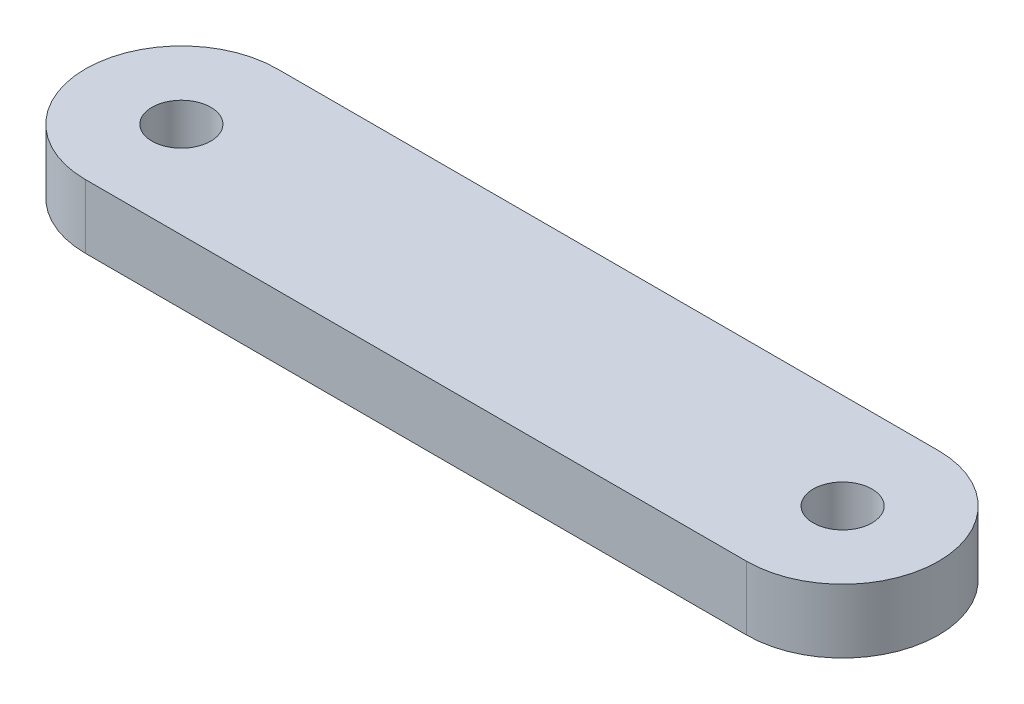
ISO-10303-21;
HEADER;
FILE_DESCRIPTION(('STEP AP214'),'2;1');
FILE_NAME('part.step','',(''),(''),'','','');
FILE_SCHEMA(('AUTOMOTIVE_DESIGN { 1 0 10303 214 1 1 1 1 }'));
ENDSEC;
DATA;
#1=APPLICATION_CONTEXT('core data for automotive mechanical design processes');
#2=APPLICATION_PROTOCOL_DEFINITION('international standard','automotive_design',2000,#1);
#3=PRODUCT_CONTEXT('',#1,'mechanical');
#4=PRODUCT('Part','Part','',(#3));
#5=PRODUCT_RELATED_PRODUCT_CATEGORY('part','',(#4));
#6=PRODUCT_DEFINITION_FORMATION('','',#4);
#7=PRODUCT_DEFINITION_CONTEXT('part definition',#1,'design');
#8=PRODUCT_DEFINITION('design','',#6,#7);
#9=PRODUCT_DEFINITION_SHAPE('','',#8);
#10=(LENGTH_UNIT() NAMED_UNIT(*) SI_UNIT(.MILLI.,.METRE.));
#11=(NAMED_UNIT(*) PLANE_ANGLE_UNIT() SI_UNIT($,.RADIAN.));
#12=(NAMED_UNIT(*) SI_UNIT($,.STERADIAN.) SOLID_ANGLE_UNIT());
#13=UNCERTAINTY_MEASURE_WITH_UNIT(LENGTH_MEASURE(1.E-05),#10,'distance_accuracy_value','');
#14=(GEOMETRIC_REPRESENTATION_CONTEXT(3) GLOBAL_UNCERTAINTY_ASSIGNED_CONTEXT((#13)) GLOBAL_UNIT_ASSIGNED_CONTEXT((#10,
#11,#12)) REPRESENTATION_CONTEXT('',''));
#15=CARTESIAN_POINT('',(0.,0.,0.));
#16=DIRECTION('',(0.,0.,1.));
#17=DIRECTION('',(1.,0.,0.));
#18=AXIS2_PLACEMENT_3D('',#15,#16,#17);
#19=CARTESIAN_POINT('',(25.8567228354206,5.,0.));
#20=DIRECTION('',(0.,-1.,0.));
#21=DIRECTION('',(0.,0.,-1.));
#22=AXIS2_PLACEMENT_3D('',#19,#20,#21);
#23=PLANE('',#22);
#24=CARTESIAN_POINT('',(25.8567228354206,5.,0.));
#25=DIRECTION('',(0.,1.,0.));
#26=DIRECTION('',(0.,0.,-1.));
#27=AXIS2_PLACEMENT_3D('',#24,#25,#26);
#28=CIRCLE('',#27,7.5);
#29=CARTESIAN_POINT('',(25.8567228354206,5.,7.5));
#30=VERTEX_POINT('',#29);
#31=CARTESIAN_POINT('',(25.8567228354206,5.,-7.5));
#32=VERTEX_POINT('',#31);
#33=EDGE_CURVE('E87',#30,#32,#28,.T.);
#34=ORIENTED_EDGE('',*,*,#33,.T.);
#35=DIRECTION('',(-1.,0.,0.));
#36=VECTOR('',#35,1.);
#37=CARTESIAN_POINT('',(-25.8567228354206,5.,-7.5));
#38=LINE('',#37,#36);
#39=CARTESIAN_POINT('',(-25.8567228354206,5.,-7.5));
#40=VERTEX_POINT('',#39);
#41=EDGE_CURVE('E82',#32,#40,#38,.T.);
#42=ORIENTED_EDGE('',*,*,#41,.T.);
#43=CARTESIAN_POINT('',(-25.8567228354206,5.,0.));
#44=DIRECTION('',(0.,1.,0.));
#45=DIRECTION('',(0.,0.,1.));
#46=AXIS2_PLACEMENT_3D('',#43,#44,#45);
#47=CIRCLE('',#46,7.5);
#48=CARTESIAN_POINT('',(-25.8567228354206,5.,7.5));
#49=VERTEX_POINT('',#48);
#50=EDGE_CURVE('E85',#40,#49,#47,.T.);
#51=ORIENTED_EDGE('',*,*,#50,.T.);
#52=DIRECTION('',(1.,0.,0.));
#53=VECTOR('',#52,1.);
#54=CARTESIAN_POINT('',(-25.8567228354206,5.,7.5));
#55=LINE('',#54,#53);
#56=EDGE_CURVE('E52',#49,#30,#55,.T.);
#57=ORIENTED_EDGE('',*,*,#56,.T.);
#58=EDGE_LOOP('',(#34,#42,#51,#57));
#59=FACE_BOUND('',#58,.T.);
#60=CARTESIAN_POINT('',(-25.8567228354206,5.,0.));
#61=DIRECTION('',(0.,1.,0.));
#62=DIRECTION('',(0.,0.,1.));
#63=AXIS2_PLACEMENT_3D('',#60,#61,#62);
#64=CIRCLE('',#63,2.30000000000001);
#65=CARTESIAN_POINT('',(-25.8567228354206,5.,2.3));
#66=VERTEX_POINT('',#65);
#67=EDGE_CURVE('E102',#66,#66,#64,.T.);
#68=ORIENTED_EDGE('',*,*,#67,.F.);
#69=EDGE_LOOP('',(#68));
#70=FACE_BOUND('',#69,.T.);
#71=CARTESIAN_POINT('',(25.8567228354206,5.,0.));
#72=DIRECTION('',(0.,1.,0.));
#73=DIRECTION('',(0.,0.,1.));
#74=AXIS2_PLACEMENT_3D('',#71,#72,#73);
#75=CIRCLE('',#74,2.3);
#76=CARTESIAN_POINT('',(25.8567228354206,5.,2.3));
#77=VERTEX_POINT('',#76);
#78=EDGE_CURVE('E117',#77,#77,#75,.T.);
#79=ORIENTED_EDGE('',*,*,#78,.F.);
#80=EDGE_LOOP('',(#79));
#81=FACE_BOUND('',#80,.T.);
#82=ADVANCED_FACE('F35',(#59,#70,#81),#23,.F.);
#83=CARTESIAN_POINT('',(25.8567228354206,0.,0.));
#84=DIRECTION('',(0.,-1.,0.));
#85=DIRECTION('',(0.,0.,-1.));
#86=AXIS2_PLACEMENT_3D('',#83,#84,#85);
#87=PLANE('',#86);
#88=CARTESIAN_POINT('',(-25.8567228354206,0.,0.));
#89=DIRECTION('',(0.,1.,0.));
#90=DIRECTION('',(0.,0.,1.));
#91=AXIS2_PLACEMENT_3D('',#88,#89,#90);
#92=CIRCLE('',#91,2.30000000000001);
#93=CARTESIAN_POINT('',(-25.8567228354206,0.,2.3));
#94=VERTEX_POINT('',#93);
#95=EDGE_CURVE('E114',#94,#94,#92,.T.);
#96=ORIENTED_EDGE('',*,*,#95,.T.);
#97=EDGE_LOOP('',(#96));
#98=FACE_BOUND('',#97,.T.);
#99=CARTESIAN_POINT('',(25.8567228354206,0.,0.));
#100=DIRECTION('',(0.,1.,0.));
#101=DIRECTION('',(0.,0.,-1.));
#102=AXIS2_PLACEMENT_3D('',#99,#100,#101);
#103=CIRCLE('',#102,7.5);
#104=CARTESIAN_POINT('',(25.8567228354206,0.,7.5));
#105=VERTEX_POINT('',#104);
#106=CARTESIAN_POINT('',(25.8567228354206,0.,-7.5));
#107=VERTEX_POINT('',#106);
#108=EDGE_CURVE('E99',#105,#107,#103,.T.);
#109=ORIENTED_EDGE('',*,*,#108,.F.);
#110=DIRECTION('',(1.,0.,0.));
#111=VECTOR('',#110,1.);
#112=CARTESIAN_POINT('',(-25.8567228354206,0.,7.5));
#113=LINE('',#112,#111);
#114=CARTESIAN_POINT('',(-25.8567228354206,0.,7.5));
#115=VERTEX_POINT('',#114);
#116=EDGE_CURVE('E75',#115,#105,#113,.T.);
#117=ORIENTED_EDGE('',*,*,#116,.F.);
#118=CARTESIAN_POINT('',(-25.8567228354206,0.,0.));
#119=DIRECTION('',(0.,1.,0.));
#120=DIRECTION('',(0.,0.,1.));
#121=AXIS2_PLACEMENT_3D('',#118,#119,#120);
#122=CIRCLE('',#121,7.5);
#123=CARTESIAN_POINT('',(-25.8567228354206,0.,-7.5));
#124=VERTEX_POINT('',#123);
#125=EDGE_CURVE('E69',#124,#115,#122,.T.);
#126=ORIENTED_EDGE('',*,*,#125,.F.);
#127=DIRECTION('',(-1.,0.,0.));
#128=VECTOR('',#127,1.);
#129=CARTESIAN_POINT('',(-25.8567228354206,0.,-7.5));
#130=LINE('',#129,#128);
#131=EDGE_CURVE('E91',#107,#124,#130,.T.);
#132=ORIENTED_EDGE('',*,*,#131,.F.);
#133=EDGE_LOOP('',(#109,#117,#126,#132));
#134=FACE_BOUND('',#133,.T.);
#135=CARTESIAN_POINT('',(25.8567228354206,0.,0.));
#136=DIRECTION('',(0.,1.,0.));
#137=DIRECTION('',(0.,0.,1.));
#138=AXIS2_PLACEMENT_3D('',#135,#136,#137);
#139=CIRCLE('',#138,2.3);
#140=CARTESIAN_POINT('',(25.8567228354206,0.,2.3));
#141=VERTEX_POINT('',#140);
#142=EDGE_CURVE('E120',#141,#141,#139,.T.);
#143=ORIENTED_EDGE('',*,*,#142,.T.);
#144=EDGE_LOOP('',(#143));
#145=FACE_BOUND('',#144,.T.);
#146=ADVANCED_FACE('F110',(#98,#134,#145),#87,.T.);
#147=CARTESIAN_POINT('',(25.8567228354206,5.,0.));
#148=DIRECTION('',(0.,-1.,0.));
#149=DIRECTION('',(0.,0.,-1.));
#150=AXIS2_PLACEMENT_3D('',#147,#148,#149);
#151=CYLINDRICAL_SURFACE('',#150,7.5);
#152=ORIENTED_EDGE('',*,*,#108,.T.);
#153=DIRECTION('',(0.,-1.,0.));
#154=VECTOR('',#153,1.);
#155=CARTESIAN_POINT('',(25.8567228354206,5.,-7.5));
#156=LINE('',#155,#154);
#157=EDGE_CURVE('E11',#32,#107,#156,.T.);
#158=ORIENTED_EDGE('',*,*,#157,.F.);
#159=ORIENTED_EDGE('',*,*,#33,.F.);
#160=DIRECTION('',(0.,-1.,0.));
#161=VECTOR('',#160,1.);
#162=CARTESIAN_POINT('',(25.8567228354206,5.,7.5));
#163=LINE('',#162,#161);
#164=EDGE_CURVE('E95',#30,#105,#163,.T.);
#165=ORIENTED_EDGE('',*,*,#164,.T.);
#166=EDGE_LOOP('',(#152,#158,#159,#165));
#167=FACE_BOUND('',#166,.T.);
#168=ADVANCED_FACE('F37',(#167),#151,.T.);
#169=CARTESIAN_POINT('',(-25.8567228354206,5.,-7.5));
#170=DIRECTION('',(0.,0.,1.));
#171=DIRECTION('',(1.,0.,0.));
#172=AXIS2_PLACEMENT_3D('',#169,#170,#171);
#173=PLANE('',#172);
#174=ORIENTED_EDGE('',*,*,#131,.T.);
#175=DIRECTION('',(0.,-1.,0.));
#176=VECTOR('',#175,1.);
#177=CARTESIAN_POINT('',(-25.8567228354206,5.,-7.5));
#178=LINE('',#177,#176);
#179=EDGE_CURVE('E44',#40,#124,#178,.T.);
#180=ORIENTED_EDGE('',*,*,#179,.F.);
#181=ORIENTED_EDGE('',*,*,#41,.F.);
#182=ORIENTED_EDGE('',*,*,#157,.T.);
#183=EDGE_LOOP('',(#174,#180,#181,#182));
#184=FACE_BOUND('',#183,.T.);
#185=ADVANCED_FACE('F90',(#184),#173,.F.);
#186=CARTESIAN_POINT('',(-25.8567228354206,5.,0.));
#187=DIRECTION('',(0.,-1.,0.));
#188=DIRECTION('',(0.,0.,-1.));
#189=AXIS2_PLACEMENT_3D('',#186,#187,#188);
#190=CYLINDRICAL_SURFACE('',#189,7.5);
#191=ORIENTED_EDGE('',*,*,#125,.T.);
#192=DIRECTION('',(0.,-1.,0.));
#193=VECTOR('',#192,1.);
#194=CARTESIAN_POINT('',(-25.8567228354206,5.,7.5));
#195=LINE('',#194,#193);
#196=EDGE_CURVE('E92',#49,#115,#195,.T.);
#197=ORIENTED_EDGE('',*,*,#196,.F.);
#198=ORIENTED_EDGE('',*,*,#50,.F.);
#199=ORIENTED_EDGE('',*,*,#179,.T.);
#200=EDGE_LOOP('',(#191,#197,#198,#199));
#201=FACE_BOUND('',#200,.T.);
#202=ADVANCED_FACE('F93',(#201),#190,.T.);
#203=CARTESIAN_POINT('',(-25.8567228354206,5.,7.5));
#204=DIRECTION('',(0.,0.,-1.));
#205=DIRECTION('',(-1.,0.,0.));
#206=AXIS2_PLACEMENT_3D('',#203,#204,#205);
#207=PLANE('',#206);
#208=ORIENTED_EDGE('',*,*,#116,.T.);
#209=ORIENTED_EDGE('',*,*,#164,.F.);
#210=ORIENTED_EDGE('',*,*,#56,.F.);
#211=ORIENTED_EDGE('',*,*,#196,.T.);
#212=EDGE_LOOP('',(#208,#209,#210,#211));
#213=FACE_BOUND('',#212,.T.);
#214=ADVANCED_FACE('F107',(#213),#207,.F.);
#215=CARTESIAN_POINT('',(-25.8567228354206,5.,0.));
#216=DIRECTION('',(0.,-1.,0.));
#217=DIRECTION('',(0.,0.,-1.));
#218=AXIS2_PLACEMENT_3D('',#215,#216,#217);
#219=CYLINDRICAL_SURFACE('',#218,2.30000000000001);
#220=ORIENTED_EDGE('',*,*,#67,.T.);
#221=EDGE_LOOP('',(#220));
#222=FACE_BOUND('',#221,.T.);
#223=ORIENTED_EDGE('',*,*,#95,.F.);
#224=EDGE_LOOP('',(#223));
#225=FACE_BOUND('',#224,.T.);
#226=ADVANCED_FACE('F137',(#222,#225),#219,.F.);
#227=CARTESIAN_POINT('',(25.8567228354206,5.,0.));
#228=DIRECTION('',(0.,-1.,0.));
#229=DIRECTION('',(0.,0.,-1.));
#230=AXIS2_PLACEMENT_3D('',#227,#228,#229);
#231=CYLINDRICAL_SURFACE('',#230,2.3);
#232=ORIENTED_EDGE('',*,*,#78,.T.);
#233=EDGE_LOOP('',(#232));
#234=FACE_BOUND('',#233,.T.);
#235=ORIENTED_EDGE('',*,*,#142,.F.);
#236=EDGE_LOOP('',(#235));
#237=FACE_BOUND('',#236,.T.);
#238=ADVANCED_FACE('F126',(#234,#237),#231,.F.);
#239=CLOSED_SHELL('',(#82,#146,#168,#185,#202,#214,#226,#238));
#240=MANIFOLD_SOLID_BREP('B2',#239);
#241=ADVANCED_BREP_SHAPE_REPRESENTATION('',(#18,#240),#14);
#242=SHAPE_DEFINITION_REPRESENTATION(#9,#241);
ENDSEC;
END-ISO-10303-21;
